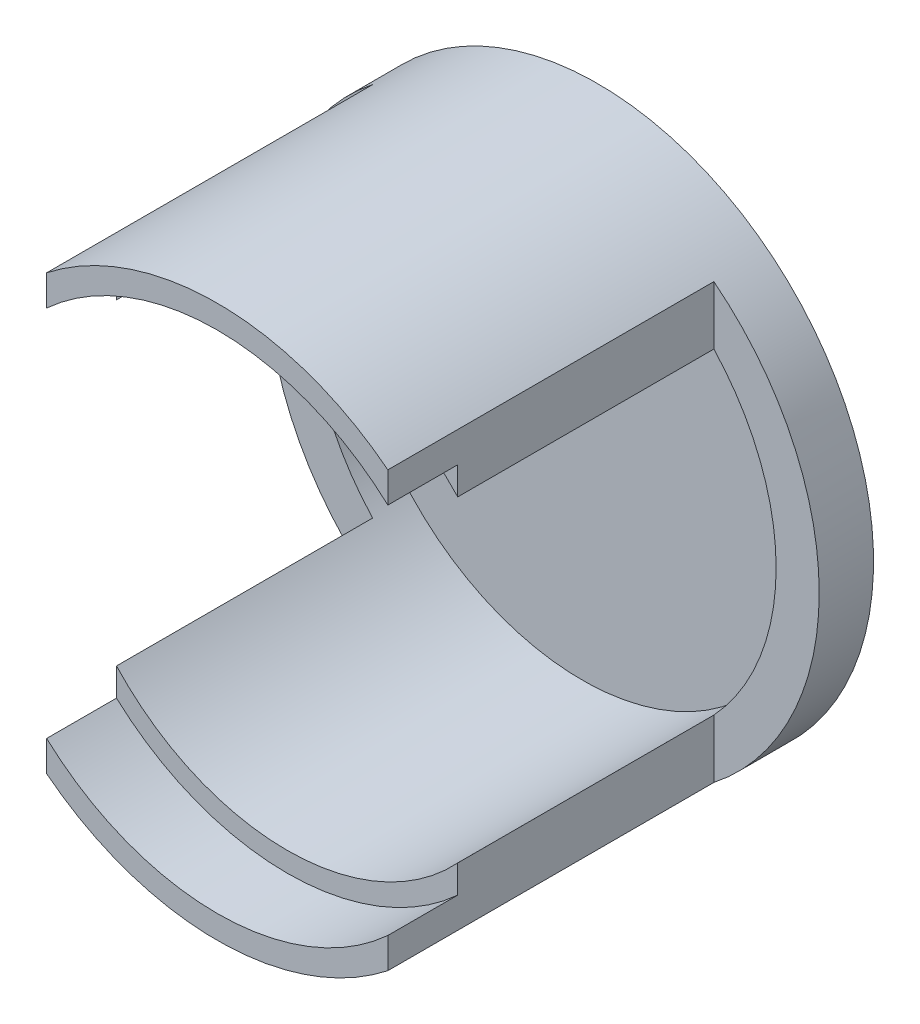
ISO-10303-21;
HEADER;
FILE_DESCRIPTION(('STEP AP214'),'2;1');
FILE_NAME('part.step','',(''),(''),'','','');
FILE_SCHEMA(('AUTOMOTIVE_DESIGN { 1 0 10303 214 1 1 1 1 }'));
ENDSEC;
DATA;
#1=APPLICATION_CONTEXT('core data for automotive mechanical design processes');
#2=APPLICATION_PROTOCOL_DEFINITION('international standard','automotive_design',2000,#1);
#3=PRODUCT_CONTEXT('',#1,'mechanical');
#4=PRODUCT('Part','Part','',(#3));
#5=PRODUCT_RELATED_PRODUCT_CATEGORY('part','',(#4));
#6=PRODUCT_DEFINITION_FORMATION('','',#4);
#7=PRODUCT_DEFINITION_CONTEXT('part definition',#1,'design');
#8=PRODUCT_DEFINITION('design','',#6,#7);
#9=PRODUCT_DEFINITION_SHAPE('','',#8);
#10=(LENGTH_UNIT() NAMED_UNIT(*) SI_UNIT(.MILLI.,.METRE.));
#11=(NAMED_UNIT(*) PLANE_ANGLE_UNIT() SI_UNIT($,.RADIAN.));
#12=(NAMED_UNIT(*) SI_UNIT($,.STERADIAN.) SOLID_ANGLE_UNIT());
#13=UNCERTAINTY_MEASURE_WITH_UNIT(LENGTH_MEASURE(1.E-05),#10,'distance_accuracy_value','');
#14=(GEOMETRIC_REPRESENTATION_CONTEXT(3) GLOBAL_UNCERTAINTY_ASSIGNED_CONTEXT((#13)) GLOBAL_UNIT_ASSIGNED_CONTEXT((#10,
#11,#12)) REPRESENTATION_CONTEXT('',''));
#15=CARTESIAN_POINT('',(0.,0.,0.));
#16=DIRECTION('',(0.,0.,1.));
#17=DIRECTION('',(1.,0.,0.));
#18=AXIS2_PLACEMENT_3D('',#15,#16,#17);
#19=CARTESIAN_POINT('',(0.,0.,47.));
#20=DIRECTION('',(0.,0.,1.));
#21=DIRECTION('',(1.,0.,0.));
#22=AXIS2_PLACEMENT_3D('',#19,#20,#21);
#23=PLANE('',#22);
#24=DIRECTION('',(0.,1.,0.));
#25=VECTOR('',#24,1.);
#26=CARTESIAN_POINT('',(-21.9800881173526,0.,47.));
#27=LINE('',#26,#25);
#28=CARTESIAN_POINT('',(-21.9800881173526,-27.9406196487017,47.));
#29=VERTEX_POINT('',#28);
#30=CARTESIAN_POINT('',(-21.9800881173526,-24.0078784225806,47.));
#31=VERTEX_POINT('',#30);
#32=EDGE_CURVE('E164',#29,#31,#27,.T.);
#33=ORIENTED_EDGE('',*,*,#32,.F.);
#34=CARTESIAN_POINT('',(0.,0.,47.));
#35=DIRECTION('',(0.,0.,1.));
#36=DIRECTION('',(1.,0.,0.));
#37=AXIS2_PLACEMENT_3D('',#34,#35,#36);
#38=CIRCLE('',#37,35.55);
#39=CARTESIAN_POINT('',(21.9800881173526,-27.9406196487017,47.));
#40=VERTEX_POINT('',#39);
#41=EDGE_CURVE('E224',#29,#40,#38,.T.);
#42=ORIENTED_EDGE('',*,*,#41,.T.);
#43=DIRECTION('',(0.,1.,0.));
#44=VECTOR('',#43,1.);
#45=CARTESIAN_POINT('',(21.9800881173526,0.,47.));
#46=LINE('',#45,#44);
#47=CARTESIAN_POINT('',(21.9800881173526,-24.0078784225806,47.));
#48=VERTEX_POINT('',#47);
#49=EDGE_CURVE('E152',#40,#48,#46,.T.);
#50=ORIENTED_EDGE('',*,*,#49,.T.);
#51=CARTESIAN_POINT('',(0.,0.,47.));
#52=DIRECTION('',(0.,0.,1.));
#53=DIRECTION('',(1.,0.,0.));
#54=AXIS2_PLACEMENT_3D('',#51,#52,#53);
#55=CIRCLE('',#54,32.55);
#56=EDGE_CURVE('E219',#31,#48,#55,.T.);
#57=ORIENTED_EDGE('',*,*,#56,.F.);
#58=EDGE_LOOP('',(#33,#42,#50,#57));
#59=FACE_BOUND('',#58,.T.);
#60=ADVANCED_FACE('F45',(#59),#23,.T.);
#61=CARTESIAN_POINT('',(-21.9800881173526,24.0078784225806,47.));
#62=VERTEX_POINT('',#61);
#63=CARTESIAN_POINT('',(-21.9800881173526,27.9406196487017,47.));
#64=VERTEX_POINT('',#63);
#65=EDGE_CURVE('E160',#62,#64,#27,.T.);
#66=ORIENTED_EDGE('',*,*,#65,.F.);
#67=CARTESIAN_POINT('',(21.9800881173526,24.0078784225806,47.));
#68=VERTEX_POINT('',#67);
#69=EDGE_CURVE('E220',#68,#62,#55,.T.);
#70=ORIENTED_EDGE('',*,*,#69,.F.);
#71=CARTESIAN_POINT('',(21.9800881173526,27.9406196487017,47.));
#72=VERTEX_POINT('',#71);
#73=EDGE_CURVE('E168',#68,#72,#46,.T.);
#74=ORIENTED_EDGE('',*,*,#73,.T.);
#75=EDGE_CURVE('E227',#72,#64,#38,.T.);
#76=ORIENTED_EDGE('',*,*,#75,.T.);
#77=EDGE_LOOP('',(#66,#70,#74,#76));
#78=FACE_BOUND('',#77,.T.);
#79=ADVANCED_FACE('F270',(#78),#23,.T.);
#80=CARTESIAN_POINT('',(0.,0.,47.));
#81=DIRECTION('',(0.,0.,-1.));
#82=DIRECTION('',(-1.,0.,0.));
#83=AXIS2_PLACEMENT_3D('',#80,#81,#82);
#84=CYLINDRICAL_SURFACE('',#83,35.55);
#85=ORIENTED_EDGE('',*,*,#41,.F.);
#86=DIRECTION('',(0.,0.,-1.));
#87=VECTOR('',#86,1.);
#88=CARTESIAN_POINT('',(-21.9800881173526,-27.9406196487017,47.));
#89=LINE('',#88,#87);
#90=CARTESIAN_POINT('',(-21.9800881173526,-27.9406196487017,5.));
#91=VERTEX_POINT('',#90);
#92=EDGE_CURVE('E202',#29,#91,#89,.T.);
#93=ORIENTED_EDGE('',*,*,#92,.T.);
#94=CARTESIAN_POINT('',(0.,0.,5.));
#95=DIRECTION('',(0.,0.,1.));
#96=DIRECTION('',(1.,0.,0.));
#97=AXIS2_PLACEMENT_3D('',#94,#95,#96);
#98=CIRCLE('',#97,35.55);
#99=CARTESIAN_POINT('',(-21.9800881173526,27.9406196487017,5.));
#100=VERTEX_POINT('',#99);
#101=EDGE_CURVE('E154',#100,#91,#98,.T.);
#102=ORIENTED_EDGE('',*,*,#101,.F.);
#103=DIRECTION('',(0.,0.,-1.));
#104=VECTOR('',#103,1.);
#105=CARTESIAN_POINT('',(-21.9800881173526,27.9406196487017,47.));
#106=LINE('',#105,#104);
#107=EDGE_CURVE('E198',#100,#64,#106,.F.);
#108=ORIENTED_EDGE('',*,*,#107,.T.);
#109=ORIENTED_EDGE('',*,*,#75,.F.);
#110=DIRECTION('',(0.,0.,-1.));
#111=VECTOR('',#110,1.);
#112=CARTESIAN_POINT('',(21.9800881173526,27.9406196487017,47.));
#113=LINE('',#112,#111);
#114=CARTESIAN_POINT('',(21.9800881173526,27.9406196487017,5.));
#115=VERTEX_POINT('',#114);
#116=EDGE_CURVE('E141',#115,#72,#113,.F.);
#117=ORIENTED_EDGE('',*,*,#116,.F.);
#118=CARTESIAN_POINT('',(0.,0.,5.));
#119=DIRECTION('',(0.,0.,1.));
#120=DIRECTION('',(1.,0.,0.));
#121=AXIS2_PLACEMENT_3D('',#118,#119,#120);
#122=CIRCLE('',#121,35.55);
#123=CARTESIAN_POINT('',(21.9800881173526,-27.9406196487017,5.));
#124=VERTEX_POINT('',#123);
#125=EDGE_CURVE('E134',#124,#115,#122,.T.);
#126=ORIENTED_EDGE('',*,*,#125,.F.);
#127=DIRECTION('',(0.,0.,-1.));
#128=VECTOR('',#127,1.);
#129=CARTESIAN_POINT('',(21.9800881173526,-27.9406196487017,47.));
#130=LINE('',#129,#128);
#131=EDGE_CURVE('E138',#40,#124,#130,.T.);
#132=ORIENTED_EDGE('',*,*,#131,.F.);
#133=EDGE_LOOP('',(#85,#93,#102,#108,#109,#117,#126,#132));
#134=FACE_BOUND('',#133,.T.);
#135=CARTESIAN_POINT('',(0.,0.,-2.));
#136=DIRECTION('',(0.,0.,-1.));
#137=DIRECTION('',(-1.,0.,0.));
#138=AXIS2_PLACEMENT_3D('',#135,#136,#137);
#139=CIRCLE('',#138,35.55);
#140=CARTESIAN_POINT('',(-35.55,0.,-2.));
#141=VERTEX_POINT('',#140);
#142=EDGE_CURVE('E211',#141,#141,#139,.T.);
#143=ORIENTED_EDGE('',*,*,#142,.F.);
#144=EDGE_LOOP('',(#143));
#145=FACE_BOUND('',#144,.T.);
#146=ADVANCED_FACE('F47',(#134,#145),#84,.T.);
#147=CARTESIAN_POINT('',(0.,0.,47.));
#148=DIRECTION('',(0.,0.,-1.));
#149=DIRECTION('',(-1.,0.,0.));
#150=AXIS2_PLACEMENT_3D('',#147,#148,#149);
#151=CYLINDRICAL_SURFACE('',#150,32.55);
#152=DIRECTION('',(0.,0.,-1.));
#153=VECTOR('',#152,1.);
#154=CARTESIAN_POINT('',(-21.9800881173526,-24.0078784225806,47.));
#155=LINE('',#154,#153);
#156=CARTESIAN_POINT('',(-21.9800881173526,-24.0078784225806,38.));
#157=VERTEX_POINT('',#156);
#158=EDGE_CURVE('E195',#31,#157,#155,.T.);
#159=ORIENTED_EDGE('',*,*,#158,.F.);
#160=ORIENTED_EDGE('',*,*,#56,.T.);
#161=DIRECTION('',(0.,0.,-1.));
#162=VECTOR('',#161,1.);
#163=CARTESIAN_POINT('',(21.9800881173526,-24.0078784225806,47.));
#164=LINE('',#163,#162);
#165=CARTESIAN_POINT('',(21.9800881173526,-24.0078784225806,38.));
#166=VERTEX_POINT('',#165);
#167=EDGE_CURVE('E180',#48,#166,#164,.T.);
#168=ORIENTED_EDGE('',*,*,#167,.T.);
#169=CARTESIAN_POINT('',(0.,0.,38.));
#170=DIRECTION('',(0.,0.,1.));
#171=DIRECTION('',(1.,0.,0.));
#172=AXIS2_PLACEMENT_3D('',#169,#170,#171);
#173=CIRCLE('',#172,32.55);
#174=EDGE_CURVE('E232',#157,#166,#173,.T.);
#175=ORIENTED_EDGE('',*,*,#174,.F.);
#176=EDGE_LOOP('',(#159,#160,#168,#175));
#177=FACE_BOUND('',#176,.T.);
#178=ADVANCED_FACE('F283',(#177),#151,.F.);
#179=DIRECTION('',(0.,0.,-1.));
#180=VECTOR('',#179,1.);
#181=CARTESIAN_POINT('',(-21.9800881173526,24.0078784225806,47.));
#182=LINE('',#181,#180);
#183=CARTESIAN_POINT('',(-21.9800881173526,24.0078784225806,38.));
#184=VERTEX_POINT('',#183);
#185=EDGE_CURVE('E191',#184,#62,#182,.F.);
#186=ORIENTED_EDGE('',*,*,#185,.F.);
#187=CARTESIAN_POINT('',(21.9800881173526,24.0078784225806,38.));
#188=VERTEX_POINT('',#187);
#189=EDGE_CURVE('E228',#188,#184,#173,.T.);
#190=ORIENTED_EDGE('',*,*,#189,.F.);
#191=DIRECTION('',(0.,0.,-1.));
#192=VECTOR('',#191,1.);
#193=CARTESIAN_POINT('',(21.9800881173526,24.0078784225806,47.));
#194=LINE('',#193,#192);
#195=EDGE_CURVE('E175',#188,#68,#194,.F.);
#196=ORIENTED_EDGE('',*,*,#195,.T.);
#197=ORIENTED_EDGE('',*,*,#69,.T.);
#198=EDGE_LOOP('',(#186,#190,#196,#197));
#199=FACE_BOUND('',#198,.T.);
#200=ADVANCED_FACE('F265',(#199),#151,.F.);
#201=CARTESIAN_POINT('',(0.,0.,38.));
#202=DIRECTION('',(0.,0.,1.));
#203=DIRECTION('',(1.,0.,0.));
#204=AXIS2_PLACEMENT_3D('',#201,#202,#203);
#205=PLANE('',#204);
#206=DIRECTION('',(0.,1.,0.));
#207=VECTOR('',#206,1.);
#208=CARTESIAN_POINT('',(-21.9800881173526,0.,38.));
#209=LINE('',#208,#207);
#210=CARTESIAN_POINT('',(-21.9800881173526,-20.4175347765937,38.));
#211=VERTEX_POINT('',#210);
#212=EDGE_CURVE('E192',#157,#211,#209,.T.);
#213=ORIENTED_EDGE('',*,*,#212,.F.);
#214=ORIENTED_EDGE('',*,*,#174,.T.);
#215=DIRECTION('',(0.,1.,0.));
#216=VECTOR('',#215,1.);
#217=CARTESIAN_POINT('',(21.9800881173526,0.,38.));
#218=LINE('',#217,#216);
#219=CARTESIAN_POINT('',(21.9800881173526,-20.4175347765937,38.));
#220=VERTEX_POINT('',#219);
#221=EDGE_CURVE('E176',#166,#220,#218,.T.);
#222=ORIENTED_EDGE('',*,*,#221,.T.);
#223=CARTESIAN_POINT('',(0.,0.,38.));
#224=DIRECTION('',(0.,0.,1.));
#225=DIRECTION('',(1.,0.,0.));
#226=AXIS2_PLACEMENT_3D('',#223,#224,#225);
#227=CIRCLE('',#226,30.);
#228=EDGE_CURVE('E212',#211,#220,#227,.T.);
#229=ORIENTED_EDGE('',*,*,#228,.F.);
#230=EDGE_LOOP('',(#213,#214,#222,#229));
#231=FACE_BOUND('',#230,.T.);
#232=ADVANCED_FACE('F278',(#231),#205,.T.);
#233=CARTESIAN_POINT('',(-21.9800881173526,20.4175347765937,38.));
#234=VERTEX_POINT('',#233);
#235=EDGE_CURVE('E188',#234,#184,#209,.T.);
#236=ORIENTED_EDGE('',*,*,#235,.F.);
#237=CARTESIAN_POINT('',(21.9800881173526,20.4175347765937,38.));
#238=VERTEX_POINT('',#237);
#239=EDGE_CURVE('E207',#238,#234,#227,.T.);
#240=ORIENTED_EDGE('',*,*,#239,.F.);
#241=EDGE_CURVE('E144',#238,#188,#218,.T.);
#242=ORIENTED_EDGE('',*,*,#241,.T.);
#243=ORIENTED_EDGE('',*,*,#189,.T.);
#244=EDGE_LOOP('',(#236,#240,#242,#243));
#245=FACE_BOUND('',#244,.T.);
#246=ADVANCED_FACE('F257',(#245),#205,.T.);
#247=CARTESIAN_POINT('',(0.,0.,38.));
#248=DIRECTION('',(0.,0.,-1.));
#249=DIRECTION('',(-1.,0.,0.));
#250=AXIS2_PLACEMENT_3D('',#247,#248,#249);
#251=CYLINDRICAL_SURFACE('',#250,30.);
#252=DIRECTION('',(0.,0.,-1.));
#253=VECTOR('',#252,1.);
#254=CARTESIAN_POINT('',(-21.9800881173526,-20.4175347765937,38.));
#255=LINE('',#254,#253);
#256=CARTESIAN_POINT('',(-21.9800881173526,-20.4175347765937,5.));
#257=VERTEX_POINT('',#256);
#258=EDGE_CURVE('E11',#211,#257,#255,.T.);
#259=ORIENTED_EDGE('',*,*,#258,.F.);
#260=ORIENTED_EDGE('',*,*,#228,.T.);
#261=DIRECTION('',(0.,0.,-1.));
#262=VECTOR('',#261,1.);
#263=CARTESIAN_POINT('',(21.9800881173526,-20.4175347765937,38.));
#264=LINE('',#263,#262);
#265=CARTESIAN_POINT('',(21.9800881173526,-20.4175347765937,5.));
#266=VERTEX_POINT('',#265);
#267=EDGE_CURVE('E239',#220,#266,#264,.T.);
#268=ORIENTED_EDGE('',*,*,#267,.T.);
#269=CARTESIAN_POINT('',(0.,0.,5.));
#270=DIRECTION('',(0.,0.,1.));
#271=DIRECTION('',(1.,0.,0.));
#272=AXIS2_PLACEMENT_3D('',#269,#270,#271);
#273=CIRCLE('',#272,30.);
#274=CARTESIAN_POINT('',(21.9800881173526,20.4175347765937,5.));
#275=VERTEX_POINT('',#274);
#276=EDGE_CURVE('E158',#266,#275,#273,.T.);
#277=ORIENTED_EDGE('',*,*,#276,.T.);
#278=DIRECTION('',(0.,0.,-1.));
#279=VECTOR('',#278,1.);
#280=CARTESIAN_POINT('',(21.9800881173526,20.4175347765937,38.));
#281=LINE('',#280,#279);
#282=EDGE_CURVE('E235',#275,#238,#281,.F.);
#283=ORIENTED_EDGE('',*,*,#282,.T.);
#284=ORIENTED_EDGE('',*,*,#239,.T.);
#285=DIRECTION('',(0.,0.,-1.));
#286=VECTOR('',#285,1.);
#287=CARTESIAN_POINT('',(-21.9800881173526,20.4175347765937,38.));
#288=LINE('',#287,#286);
#289=CARTESIAN_POINT('',(-21.9800881173526,20.4175347765937,5.));
#290=VERTEX_POINT('',#289);
#291=EDGE_CURVE('E54',#290,#234,#288,.F.);
#292=ORIENTED_EDGE('',*,*,#291,.F.);
#293=CARTESIAN_POINT('',(0.,0.,5.));
#294=DIRECTION('',(0.,0.,1.));
#295=DIRECTION('',(1.,0.,0.));
#296=AXIS2_PLACEMENT_3D('',#293,#294,#295);
#297=CIRCLE('',#296,30.);
#298=EDGE_CURVE('E242',#290,#257,#297,.T.);
#299=ORIENTED_EDGE('',*,*,#298,.T.);
#300=EDGE_LOOP('',(#259,#260,#268,#277,#283,#284,#292,#299));
#301=FACE_BOUND('',#300,.T.);
#302=CARTESIAN_POINT('',(0.,0.,0.));
#303=DIRECTION('',(0.,0.,1.));
#304=DIRECTION('',(1.,0.,0.));
#305=AXIS2_PLACEMENT_3D('',#302,#303,#304);
#306=CIRCLE('',#305,30.);
#307=CARTESIAN_POINT('',(30.,0.,0.));
#308=VERTEX_POINT('',#307);
#309=EDGE_CURVE('E206',#308,#308,#306,.T.);
#310=ORIENTED_EDGE('',*,*,#309,.F.);
#311=EDGE_LOOP('',(#310));
#312=FACE_BOUND('',#311,.T.);
#313=ADVANCED_FACE('F260',(#301,#312),#251,.F.);
#314=CARTESIAN_POINT('',(0.,0.,-2.));
#315=DIRECTION('',(0.,0.,-1.));
#316=DIRECTION('',(-1.,0.,0.));
#317=AXIS2_PLACEMENT_3D('',#314,#315,#316);
#318=PLANE('',#317);
#319=ORIENTED_EDGE('',*,*,#142,.T.);
#320=EDGE_LOOP('',(#319));
#321=FACE_BOUND('',#320,.T.);
#322=ADVANCED_FACE('F316',(#321),#318,.T.);
#323=CARTESIAN_POINT('',(0.,0.,0.));
#324=DIRECTION('',(0.,0.,-1.));
#325=DIRECTION('',(-1.,0.,0.));
#326=AXIS2_PLACEMENT_3D('',#323,#324,#325);
#327=PLANE('',#326);
#328=ORIENTED_EDGE('',*,*,#309,.T.);
#329=EDGE_LOOP('',(#328));
#330=FACE_BOUND('',#329,.T.);
#331=ADVANCED_FACE('F314',(#330),#327,.F.);
#332=CARTESIAN_POINT('',(21.9800881173526,0.,5.));
#333=DIRECTION('',(1.,0.,0.));
#334=DIRECTION('',(0.,0.,-1.));
#335=AXIS2_PLACEMENT_3D('',#332,#333,#334);
#336=PLANE('',#335);
#337=ORIENTED_EDGE('',*,*,#131,.T.);
#338=DIRECTION('',(0.,1.,0.));
#339=VECTOR('',#338,1.);
#340=CARTESIAN_POINT('',(21.9800881173526,0.,5.));
#341=LINE('',#340,#339);
#342=EDGE_CURVE('E149',#124,#266,#341,.T.);
#343=ORIENTED_EDGE('',*,*,#342,.T.);
#344=ORIENTED_EDGE('',*,*,#267,.F.);
#345=ORIENTED_EDGE('',*,*,#221,.F.);
#346=ORIENTED_EDGE('',*,*,#167,.F.);
#347=ORIENTED_EDGE('',*,*,#49,.F.);
#348=EDGE_LOOP('',(#337,#343,#344,#345,#346,#347));
#349=FACE_BOUND('',#348,.T.);
#350=ADVANCED_FACE('F148',(#349),#336,.T.);
#351=ORIENTED_EDGE('',*,*,#116,.T.);
#352=ORIENTED_EDGE('',*,*,#73,.F.);
#353=ORIENTED_EDGE('',*,*,#195,.F.);
#354=ORIENTED_EDGE('',*,*,#241,.F.);
#355=ORIENTED_EDGE('',*,*,#282,.F.);
#356=EDGE_CURVE('E68',#275,#115,#341,.T.);
#357=ORIENTED_EDGE('',*,*,#356,.T.);
#358=EDGE_LOOP('',(#351,#352,#353,#354,#355,#357));
#359=FACE_BOUND('',#358,.T.);
#360=ADVANCED_FACE('F263',(#359),#336,.T.);
#361=CARTESIAN_POINT('',(0.,0.,5.));
#362=DIRECTION('',(0.,0.,1.));
#363=DIRECTION('',(1.,0.,0.));
#364=AXIS2_PLACEMENT_3D('',#361,#362,#363);
#365=PLANE('',#364);
#366=ORIENTED_EDGE('',*,*,#125,.T.);
#367=ORIENTED_EDGE('',*,*,#356,.F.);
#368=ORIENTED_EDGE('',*,*,#276,.F.);
#369=ORIENTED_EDGE('',*,*,#342,.F.);
#370=EDGE_LOOP('',(#366,#367,#368,#369));
#371=FACE_BOUND('',#370,.T.);
#372=ADVANCED_FACE('F156',(#371),#365,.T.);
#373=CARTESIAN_POINT('',(-21.9800881173526,0.,5.));
#374=DIRECTION('',(1.,0.,0.));
#375=DIRECTION('',(0.,0.,-1.));
#376=AXIS2_PLACEMENT_3D('',#373,#374,#375);
#377=PLANE('',#376);
#378=ORIENTED_EDGE('',*,*,#32,.T.);
#379=ORIENTED_EDGE('',*,*,#158,.T.);
#380=ORIENTED_EDGE('',*,*,#212,.T.);
#381=ORIENTED_EDGE('',*,*,#258,.T.);
#382=DIRECTION('',(0.,1.,0.));
#383=VECTOR('',#382,1.);
#384=CARTESIAN_POINT('',(-21.9800881173526,0.,5.));
#385=LINE('',#384,#383);
#386=EDGE_CURVE('E61',#91,#257,#385,.T.);
#387=ORIENTED_EDGE('',*,*,#386,.F.);
#388=ORIENTED_EDGE('',*,*,#92,.F.);
#389=EDGE_LOOP('',(#378,#379,#380,#381,#387,#388));
#390=FACE_BOUND('',#389,.T.);
#391=ADVANCED_FACE('F291',(#390),#377,.F.);
#392=EDGE_CURVE('E253',#290,#100,#385,.T.);
#393=ORIENTED_EDGE('',*,*,#392,.F.);
#394=ORIENTED_EDGE('',*,*,#291,.T.);
#395=ORIENTED_EDGE('',*,*,#235,.T.);
#396=ORIENTED_EDGE('',*,*,#185,.T.);
#397=ORIENTED_EDGE('',*,*,#65,.T.);
#398=ORIENTED_EDGE('',*,*,#107,.F.);
#399=EDGE_LOOP('',(#393,#394,#395,#396,#397,#398));
#400=FACE_BOUND('',#399,.T.);
#401=ADVANCED_FACE('F250',(#400),#377,.F.);
#402=CARTESIAN_POINT('',(0.,0.,5.));
#403=DIRECTION('',(0.,0.,1.));
#404=DIRECTION('',(1.,0.,0.));
#405=AXIS2_PLACEMENT_3D('',#402,#403,#404);
#406=PLANE('',#405);
#407=ORIENTED_EDGE('',*,*,#101,.T.);
#408=ORIENTED_EDGE('',*,*,#386,.T.);
#409=ORIENTED_EDGE('',*,*,#298,.F.);
#410=ORIENTED_EDGE('',*,*,#392,.T.);
#411=EDGE_LOOP('',(#407,#408,#409,#410));
#412=FACE_BOUND('',#411,.T.);
#413=ADVANCED_FACE('F295',(#412),#406,.T.);
#414=CLOSED_SHELL('',(#60,#79,#146,#178,#200,#232,#246,#313,#322,#331,#350,#360,#372,#391,#401,#413));
#415=MANIFOLD_SOLID_BREP('B2',#414);
#416=ADVANCED_BREP_SHAPE_REPRESENTATION('',(#18,#415),#14);
#417=SHAPE_DEFINITION_REPRESENTATION(#9,#416);
ENDSEC;
END-ISO-10303-21;
